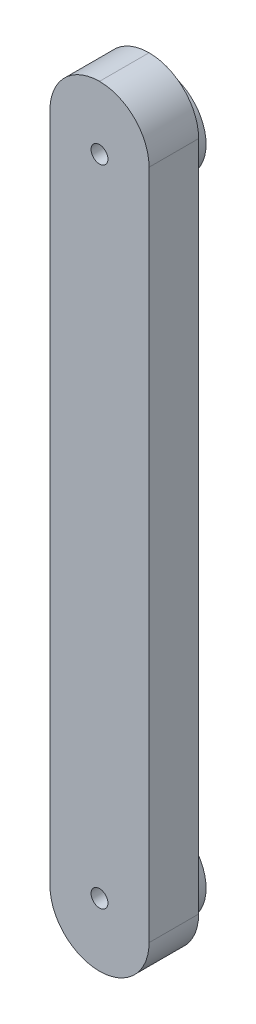
ISO-10303-21;
HEADER;
FILE_DESCRIPTION(('STEP AP214'),'2;1');
FILE_NAME('part.step','',(''),(''),'','','');
FILE_SCHEMA(('AUTOMOTIVE_DESIGN { 1 0 10303 214 1 1 1 1 }'));
ENDSEC;
DATA;
#1=APPLICATION_CONTEXT('core data for automotive mechanical design processes');
#2=APPLICATION_PROTOCOL_DEFINITION('international standard','automotive_design',2000,#1);
#3=PRODUCT_CONTEXT('',#1,'mechanical');
#4=PRODUCT('Part','Part','',(#3));
#5=PRODUCT_RELATED_PRODUCT_CATEGORY('part','',(#4));
#6=PRODUCT_DEFINITION_FORMATION('','',#4);
#7=PRODUCT_DEFINITION_CONTEXT('part definition',#1,'design');
#8=PRODUCT_DEFINITION('design','',#6,#7);
#9=PRODUCT_DEFINITION_SHAPE('','',#8);
#10=(LENGTH_UNIT() NAMED_UNIT(*) SI_UNIT(.MILLI.,.METRE.));
#11=(NAMED_UNIT(*) PLANE_ANGLE_UNIT() SI_UNIT($,.RADIAN.));
#12=(NAMED_UNIT(*) SI_UNIT($,.STERADIAN.) SOLID_ANGLE_UNIT());
#13=UNCERTAINTY_MEASURE_WITH_UNIT(LENGTH_MEASURE(1.E-05),#10,'distance_accuracy_value','');
#14=(GEOMETRIC_REPRESENTATION_CONTEXT(3) GLOBAL_UNCERTAINTY_ASSIGNED_CONTEXT((#13)) GLOBAL_UNIT_ASSIGNED_CONTEXT((#10,
#11,#12)) REPRESENTATION_CONTEXT('',''));
#15=CARTESIAN_POINT('',(0.,0.,0.));
#16=DIRECTION('',(0.,0.,1.));
#17=DIRECTION('',(1.,0.,0.));
#18=AXIS2_PLACEMENT_3D('',#15,#16,#17);
#19=CARTESIAN_POINT('',(-9.99999999999999,77.75,10.));
#20=DIRECTION('',(1.,0.,0.));
#21=DIRECTION('',(0.,1.,0.));
#22=AXIS2_PLACEMENT_3D('',#19,#20,#21);
#23=PLANE('',#22);
#24=DIRECTION('',(0.,-1.,0.));
#25=VECTOR('',#24,1.);
#26=CARTESIAN_POINT('',(-9.99999999999999,77.75,0.));
#27=LINE('',#26,#25);
#28=CARTESIAN_POINT('',(-9.99999999999999,67.75,0.));
#29=VERTEX_POINT('',#28);
#30=CARTESIAN_POINT('',(-9.99999999999999,-67.75,0.));
#31=VERTEX_POINT('',#30);
#32=EDGE_CURVE('E113',#29,#31,#27,.T.);
#33=ORIENTED_EDGE('',*,*,#32,.T.);
#34=DIRECTION('',(0.,0.,-1.));
#35=VECTOR('',#34,1.);
#36=CARTESIAN_POINT('',(-9.99999999999999,-67.75,10.));
#37=LINE('',#36,#35);
#38=CARTESIAN_POINT('',(-9.99999999999999,-67.75,10.));
#39=VERTEX_POINT('',#38);
#40=EDGE_CURVE('E11',#31,#39,#37,.F.);
#41=ORIENTED_EDGE('',*,*,#40,.T.);
#42=DIRECTION('',(0.,-1.,0.));
#43=VECTOR('',#42,1.);
#44=CARTESIAN_POINT('',(-9.99999999999999,77.75,10.));
#45=LINE('',#44,#43);
#46=CARTESIAN_POINT('',(-9.99999999999999,67.75,10.));
#47=VERTEX_POINT('',#46);
#48=EDGE_CURVE('E112',#47,#39,#45,.T.);
#49=ORIENTED_EDGE('',*,*,#48,.F.);
#50=DIRECTION('',(0.,0.,-1.));
#51=VECTOR('',#50,1.);
#52=CARTESIAN_POINT('',(-9.99999999999999,67.75,10.));
#53=LINE('',#52,#51);
#54=EDGE_CURVE('E43',#47,#29,#53,.T.);
#55=ORIENTED_EDGE('',*,*,#54,.T.);
#56=EDGE_LOOP('',(#33,#41,#49,#55));
#57=FACE_BOUND('',#56,.T.);
#58=ADVANCED_FACE('F34',(#57),#23,.F.);
#59=CARTESIAN_POINT('',(10.,77.75,10.));
#60=DIRECTION('',(-1.,0.,0.));
#61=DIRECTION('',(0.,0.,1.));
#62=AXIS2_PLACEMENT_3D('',#59,#60,#61);
#63=PLANE('',#62);
#64=DIRECTION('',(0.,1.,0.));
#65=VECTOR('',#64,1.);
#66=CARTESIAN_POINT('',(10.,77.75,10.));
#67=LINE('',#66,#65);
#68=CARTESIAN_POINT('',(10.,-67.75,10.));
#69=VERTEX_POINT('',#68);
#70=CARTESIAN_POINT('',(10.,67.75,10.));
#71=VERTEX_POINT('',#70);
#72=EDGE_CURVE('E106',#69,#71,#67,.T.);
#73=ORIENTED_EDGE('',*,*,#72,.F.);
#74=DIRECTION('',(0.,0.,-1.));
#75=VECTOR('',#74,1.);
#76=CARTESIAN_POINT('',(10.,-67.75,10.));
#77=LINE('',#76,#75);
#78=CARTESIAN_POINT('',(10.,-67.75,0.));
#79=VERTEX_POINT('',#78);
#80=EDGE_CURVE('E93',#69,#79,#77,.T.);
#81=ORIENTED_EDGE('',*,*,#80,.T.);
#82=DIRECTION('',(0.,1.,0.));
#83=VECTOR('',#82,1.);
#84=CARTESIAN_POINT('',(10.,77.75,0.));
#85=LINE('',#84,#83);
#86=CARTESIAN_POINT('',(10.,67.75,0.));
#87=VERTEX_POINT('',#86);
#88=EDGE_CURVE('E104',#79,#87,#85,.T.);
#89=ORIENTED_EDGE('',*,*,#88,.T.);
#90=DIRECTION('',(0.,0.,-1.));
#91=VECTOR('',#90,1.);
#92=CARTESIAN_POINT('',(10.,67.75,10.));
#93=LINE('',#92,#91);
#94=EDGE_CURVE('E108',#87,#71,#93,.F.);
#95=ORIENTED_EDGE('',*,*,#94,.T.);
#96=EDGE_LOOP('',(#73,#81,#89,#95));
#97=FACE_BOUND('',#96,.T.);
#98=ADVANCED_FACE('F103',(#97),#63,.F.);
#99=CARTESIAN_POINT('',(0.,0.,10.));
#100=DIRECTION('',(0.,0.,1.));
#101=DIRECTION('',(1.,0.,0.));
#102=AXIS2_PLACEMENT_3D('',#99,#100,#101);
#103=PLANE('',#102);
#104=CARTESIAN_POINT('',(0.,65.,10.));
#105=DIRECTION('',(0.,0.,-1.));
#106=DIRECTION('',(-1.,0.,0.));
#107=AXIS2_PLACEMENT_3D('',#104,#105,#106);
#108=CIRCLE('',#107,1.7);
#109=CARTESIAN_POINT('',(-1.70000000000002,65.,10.));
#110=VERTEX_POINT('',#109);
#111=EDGE_CURVE('E155',#110,#110,#108,.T.);
#112=ORIENTED_EDGE('',*,*,#111,.T.);
#113=EDGE_LOOP('',(#112));
#114=FACE_BOUND('',#113,.T.);
#115=CARTESIAN_POINT('',(0.,-65.,10.));
#116=DIRECTION('',(0.,0.,-1.));
#117=DIRECTION('',(-1.,0.,0.));
#118=AXIS2_PLACEMENT_3D('',#115,#116,#117);
#119=CIRCLE('',#118,1.7);
#120=CARTESIAN_POINT('',(-1.70000000000002,-65.,10.));
#121=VERTEX_POINT('',#120);
#122=EDGE_CURVE('E141',#121,#121,#119,.T.);
#123=ORIENTED_EDGE('',*,*,#122,.T.);
#124=EDGE_LOOP('',(#123));
#125=FACE_BOUND('',#124,.T.);
#126=CARTESIAN_POINT('',(0.,-67.75,10.));
#127=DIRECTION('',(0.,0.,1.));
#128=DIRECTION('',(1.,0.,0.));
#129=AXIS2_PLACEMENT_3D('',#126,#127,#128);
#130=CIRCLE('',#129,10.);
#131=CARTESIAN_POINT('',(0.,-77.75,10.));
#132=VERTEX_POINT('',#131);
#133=EDGE_CURVE('E58',#39,#132,#130,.T.);
#134=ORIENTED_EDGE('',*,*,#133,.T.);
#135=CARTESIAN_POINT('',(0.,-67.75,10.));
#136=DIRECTION('',(0.,0.,1.));
#137=DIRECTION('',(1.,0.,0.));
#138=AXIS2_PLACEMENT_3D('',#135,#136,#137);
#139=CIRCLE('',#138,10.);
#140=EDGE_CURVE('E136',#132,#69,#139,.T.);
#141=ORIENTED_EDGE('',*,*,#140,.T.);
#142=ORIENTED_EDGE('',*,*,#72,.T.);
#143=CARTESIAN_POINT('',(0.,67.75,10.));
#144=DIRECTION('',(0.,0.,1.));
#145=DIRECTION('',(1.,0.,0.));
#146=AXIS2_PLACEMENT_3D('',#143,#144,#145);
#147=CIRCLE('',#146,10.);
#148=CARTESIAN_POINT('',(0.,77.75,10.));
#149=VERTEX_POINT('',#148);
#150=EDGE_CURVE('E51',#71,#149,#147,.T.);
#151=ORIENTED_EDGE('',*,*,#150,.T.);
#152=CARTESIAN_POINT('',(0.,67.75,10.));
#153=DIRECTION('',(0.,0.,1.));
#154=DIRECTION('',(1.,0.,0.));
#155=AXIS2_PLACEMENT_3D('',#152,#153,#154);
#156=CIRCLE('',#155,10.);
#157=EDGE_CURVE('E133',#149,#47,#156,.T.);
#158=ORIENTED_EDGE('',*,*,#157,.T.);
#159=ORIENTED_EDGE('',*,*,#48,.T.);
#160=EDGE_LOOP('',(#134,#141,#142,#151,#158,#159));
#161=FACE_BOUND('',#160,.T.);
#162=ADVANCED_FACE('F149',(#114,#125,#161),#103,.T.);
#163=CARTESIAN_POINT('',(0.,0.,0.));
#164=DIRECTION('',(0.,0.,1.));
#165=DIRECTION('',(1.,0.,0.));
#166=AXIS2_PLACEMENT_3D('',#163,#164,#165);
#167=PLANE('',#166);
#168=CARTESIAN_POINT('',(0.,-65.,0.));
#169=DIRECTION('',(0.,0.,1.));
#170=DIRECTION('',(1.,0.,0.));
#171=AXIS2_PLACEMENT_3D('',#168,#169,#170);
#172=CIRCLE('',#171,9.);
#173=CARTESIAN_POINT('',(8.99999999999999,-65.,0.));
#174=VERTEX_POINT('',#173);
#175=EDGE_CURVE('E124',#174,#174,#172,.F.);
#176=ORIENTED_EDGE('',*,*,#175,.F.);
#177=EDGE_LOOP('',(#176));
#178=FACE_BOUND('',#177,.T.);
#179=CARTESIAN_POINT('',(0.,65.,0.));
#180=DIRECTION('',(0.,0.,1.));
#181=DIRECTION('',(1.,0.,0.));
#182=AXIS2_PLACEMENT_3D('',#179,#180,#181);
#183=CIRCLE('',#182,9.);
#184=CARTESIAN_POINT('',(8.99999999999998,65.,0.));
#185=VERTEX_POINT('',#184);
#186=EDGE_CURVE('E121',#185,#185,#183,.F.);
#187=ORIENTED_EDGE('',*,*,#186,.F.);
#188=EDGE_LOOP('',(#187));
#189=FACE_BOUND('',#188,.T.);
#190=ORIENTED_EDGE('',*,*,#88,.F.);
#191=CARTESIAN_POINT('',(0.,-67.75,0.));
#192=DIRECTION('',(0.,0.,1.));
#193=DIRECTION('',(1.,0.,0.));
#194=AXIS2_PLACEMENT_3D('',#191,#192,#193);
#195=CIRCLE('',#194,10.);
#196=CARTESIAN_POINT('',(0.,-77.75,0.));
#197=VERTEX_POINT('',#196);
#198=EDGE_CURVE('E89',#79,#197,#195,.F.);
#199=ORIENTED_EDGE('',*,*,#198,.T.);
#200=CARTESIAN_POINT('',(0.,-67.75,0.));
#201=DIRECTION('',(0.,0.,1.));
#202=DIRECTION('',(1.,0.,0.));
#203=AXIS2_PLACEMENT_3D('',#200,#201,#202);
#204=CIRCLE('',#203,10.);
#205=EDGE_CURVE('E98',#197,#31,#204,.F.);
#206=ORIENTED_EDGE('',*,*,#205,.T.);
#207=ORIENTED_EDGE('',*,*,#32,.F.);
#208=CARTESIAN_POINT('',(0.,67.75,0.));
#209=DIRECTION('',(0.,0.,1.));
#210=DIRECTION('',(1.,0.,0.));
#211=AXIS2_PLACEMENT_3D('',#208,#209,#210);
#212=CIRCLE('',#211,10.);
#213=CARTESIAN_POINT('',(0.,77.75,0.));
#214=VERTEX_POINT('',#213);
#215=EDGE_CURVE('E129',#29,#214,#212,.F.);
#216=ORIENTED_EDGE('',*,*,#215,.T.);
#217=CARTESIAN_POINT('',(0.,67.75,0.));
#218=DIRECTION('',(0.,0.,1.));
#219=DIRECTION('',(1.,0.,0.));
#220=AXIS2_PLACEMENT_3D('',#217,#218,#219);
#221=CIRCLE('',#220,10.);
#222=EDGE_CURVE('E107',#214,#87,#221,.F.);
#223=ORIENTED_EDGE('',*,*,#222,.T.);
#224=EDGE_LOOP('',(#190,#199,#206,#207,#216,#223));
#225=FACE_BOUND('',#224,.T.);
#226=ADVANCED_FACE('F110',(#178,#189,#225),#167,.F.);
#227=CARTESIAN_POINT('',(0.,65.,-2.5));
#228=DIRECTION('',(0.,0.,1.));
#229=DIRECTION('',(1.,0.,0.));
#230=AXIS2_PLACEMENT_3D('',#227,#228,#229);
#231=CYLINDRICAL_SURFACE('',#230,9.);
#232=CARTESIAN_POINT('',(0.,65.,-2.5));
#233=DIRECTION('',(0.,0.,-1.));
#234=DIRECTION('',(-1.,0.,0.));
#235=AXIS2_PLACEMENT_3D('',#232,#233,#234);
#236=CIRCLE('',#235,9.);
#237=CARTESIAN_POINT('',(-9.00000000000001,65.,-2.5));
#238=VERTEX_POINT('',#237);
#239=EDGE_CURVE('E117',#238,#238,#236,.T.);
#240=ORIENTED_EDGE('',*,*,#239,.F.);
#241=EDGE_LOOP('',(#240));
#242=FACE_BOUND('',#241,.T.);
#243=ORIENTED_EDGE('',*,*,#186,.T.);
#244=EDGE_LOOP('',(#243));
#245=FACE_BOUND('',#244,.T.);
#246=ADVANCED_FACE('F179',(#242,#245),#231,.T.);
#247=CARTESIAN_POINT('',(0.,65.,-2.5));
#248=DIRECTION('',(0.,0.,-1.));
#249=DIRECTION('',(-1.,0.,0.));
#250=AXIS2_PLACEMENT_3D('',#247,#248,#249);
#251=PLANE('',#250);
#252=CARTESIAN_POINT('',(0.,65.,-2.5));
#253=DIRECTION('',(0.,0.,-1.));
#254=DIRECTION('',(-1.,0.,0.));
#255=AXIS2_PLACEMENT_3D('',#252,#253,#254);
#256=CIRCLE('',#255,1.7);
#257=CARTESIAN_POINT('',(-1.70000000000002,65.,-2.5));
#258=VERTEX_POINT('',#257);
#259=EDGE_CURVE('E159',#258,#258,#256,.T.);
#260=ORIENTED_EDGE('',*,*,#259,.F.);
#261=EDGE_LOOP('',(#260));
#262=FACE_BOUND('',#261,.T.);
#263=ORIENTED_EDGE('',*,*,#239,.T.);
#264=EDGE_LOOP('',(#263));
#265=FACE_BOUND('',#264,.T.);
#266=ADVANCED_FACE('F175',(#262,#265),#251,.T.);
#267=CARTESIAN_POINT('',(0.,-65.,-2.5));
#268=DIRECTION('',(0.,0.,1.));
#269=DIRECTION('',(1.,0.,0.));
#270=AXIS2_PLACEMENT_3D('',#267,#268,#269);
#271=CYLINDRICAL_SURFACE('',#270,9.);
#272=CARTESIAN_POINT('',(0.,-65.,-2.5));
#273=DIRECTION('',(0.,0.,-1.));
#274=DIRECTION('',(-1.,0.,0.));
#275=AXIS2_PLACEMENT_3D('',#272,#273,#274);
#276=CIRCLE('',#275,9.);
#277=CARTESIAN_POINT('',(-9.00000000000001,-65.,-2.5));
#278=VERTEX_POINT('',#277);
#279=EDGE_CURVE('E153',#278,#278,#276,.T.);
#280=ORIENTED_EDGE('',*,*,#279,.F.);
#281=EDGE_LOOP('',(#280));
#282=FACE_BOUND('',#281,.T.);
#283=ORIENTED_EDGE('',*,*,#175,.T.);
#284=EDGE_LOOP('',(#283));
#285=FACE_BOUND('',#284,.T.);
#286=ADVANCED_FACE('F178',(#282,#285),#271,.T.);
#287=CARTESIAN_POINT('',(0.,-65.,-2.5));
#288=DIRECTION('',(0.,0.,-1.));
#289=DIRECTION('',(-1.,0.,0.));
#290=AXIS2_PLACEMENT_3D('',#287,#288,#289);
#291=PLANE('',#290);
#292=CARTESIAN_POINT('',(0.,-65.,-2.5));
#293=DIRECTION('',(0.,0.,-1.));
#294=DIRECTION('',(-1.,0.,0.));
#295=AXIS2_PLACEMENT_3D('',#292,#293,#294);
#296=CIRCLE('',#295,1.7);
#297=CARTESIAN_POINT('',(-1.70000000000002,-65.,-2.5));
#298=VERTEX_POINT('',#297);
#299=EDGE_CURVE('E139',#298,#298,#296,.T.);
#300=ORIENTED_EDGE('',*,*,#299,.F.);
#301=EDGE_LOOP('',(#300));
#302=FACE_BOUND('',#301,.T.);
#303=ORIENTED_EDGE('',*,*,#279,.T.);
#304=EDGE_LOOP('',(#303));
#305=FACE_BOUND('',#304,.T.);
#306=ADVANCED_FACE('F232',(#302,#305),#291,.T.);
#307=CARTESIAN_POINT('',(0.,-65.,10.));
#308=DIRECTION('',(0.,0.,-1.));
#309=DIRECTION('',(-1.,0.,0.));
#310=AXIS2_PLACEMENT_3D('',#307,#308,#309);
#311=CYLINDRICAL_SURFACE('',#310,1.7);
#312=ORIENTED_EDGE('',*,*,#122,.F.);
#313=EDGE_LOOP('',(#312));
#314=FACE_BOUND('',#313,.T.);
#315=ORIENTED_EDGE('',*,*,#299,.T.);
#316=EDGE_LOOP('',(#315));
#317=FACE_BOUND('',#316,.T.);
#318=ADVANCED_FACE('F171',(#314,#317),#311,.F.);
#319=CARTESIAN_POINT('',(0.,65.,10.));
#320=DIRECTION('',(0.,0.,-1.));
#321=DIRECTION('',(-1.,0.,0.));
#322=AXIS2_PLACEMENT_3D('',#319,#320,#321);
#323=CYLINDRICAL_SURFACE('',#322,1.7);
#324=ORIENTED_EDGE('',*,*,#111,.F.);
#325=EDGE_LOOP('',(#324));
#326=FACE_BOUND('',#325,.T.);
#327=ORIENTED_EDGE('',*,*,#259,.T.);
#328=EDGE_LOOP('',(#327));
#329=FACE_BOUND('',#328,.T.);
#330=ADVANCED_FACE('F167',(#326,#329),#323,.F.);
#331=CARTESIAN_POINT('',(0.,-67.75,10.));
#332=DIRECTION('',(0.,0.,-1.));
#333=DIRECTION('',(-1.,0.,0.));
#334=AXIS2_PLACEMENT_3D('',#331,#332,#333);
#335=CYLINDRICAL_SURFACE('',#334,10.);
#336=DIRECTION('',(0.,0.,-1.));
#337=VECTOR('',#336,1.);
#338=CARTESIAN_POINT('',(0.,-77.75,10.));
#339=LINE('',#338,#337);
#340=EDGE_CURVE('E94',#132,#197,#339,.T.);
#341=ORIENTED_EDGE('',*,*,#340,.F.);
#342=ORIENTED_EDGE('',*,*,#133,.F.);
#343=ORIENTED_EDGE('',*,*,#40,.F.);
#344=ORIENTED_EDGE('',*,*,#205,.F.);
#345=EDGE_LOOP('',(#341,#342,#343,#344));
#346=FACE_BOUND('',#345,.T.);
#347=ADVANCED_FACE('F170',(#346),#335,.T.);
#348=CARTESIAN_POINT('',(0.,-67.75,10.));
#349=DIRECTION('',(0.,0.,-1.));
#350=DIRECTION('',(-1.,0.,0.));
#351=AXIS2_PLACEMENT_3D('',#348,#349,#350);
#352=CYLINDRICAL_SURFACE('',#351,10.);
#353=ORIENTED_EDGE('',*,*,#140,.F.);
#354=ORIENTED_EDGE('',*,*,#340,.T.);
#355=ORIENTED_EDGE('',*,*,#198,.F.);
#356=ORIENTED_EDGE('',*,*,#80,.F.);
#357=EDGE_LOOP('',(#353,#354,#355,#356));
#358=FACE_BOUND('',#357,.T.);
#359=ADVANCED_FACE('F92',(#358),#352,.T.);
#360=CARTESIAN_POINT('',(0.,67.75,10.));
#361=DIRECTION('',(0.,0.,-1.));
#362=DIRECTION('',(-1.,0.,0.));
#363=AXIS2_PLACEMENT_3D('',#360,#361,#362);
#364=CYLINDRICAL_SURFACE('',#363,10.);
#365=DIRECTION('',(0.,0.,-1.));
#366=VECTOR('',#365,1.);
#367=CARTESIAN_POINT('',(0.,77.75,10.));
#368=LINE('',#367,#366);
#369=EDGE_CURVE('E38',#149,#214,#368,.T.);
#370=ORIENTED_EDGE('',*,*,#369,.F.);
#371=ORIENTED_EDGE('',*,*,#150,.F.);
#372=ORIENTED_EDGE('',*,*,#94,.F.);
#373=ORIENTED_EDGE('',*,*,#222,.F.);
#374=EDGE_LOOP('',(#370,#371,#372,#373));
#375=FACE_BOUND('',#374,.T.);
#376=ADVANCED_FACE('F36',(#375),#364,.T.);
#377=CARTESIAN_POINT('',(0.,67.75,10.));
#378=DIRECTION('',(0.,0.,-1.));
#379=DIRECTION('',(-1.,0.,0.));
#380=AXIS2_PLACEMENT_3D('',#377,#378,#379);
#381=CYLINDRICAL_SURFACE('',#380,10.);
#382=ORIENTED_EDGE('',*,*,#157,.F.);
#383=ORIENTED_EDGE('',*,*,#369,.T.);
#384=ORIENTED_EDGE('',*,*,#215,.F.);
#385=ORIENTED_EDGE('',*,*,#54,.F.);
#386=EDGE_LOOP('',(#382,#383,#384,#385));
#387=FACE_BOUND('',#386,.T.);
#388=ADVANCED_FACE('F146',(#387),#381,.T.);
#389=CLOSED_SHELL('',(#58,#98,#162,#226,#246,#266,#286,#306,#318,#330,#347,#359,#376,#388));
#390=MANIFOLD_SOLID_BREP('B2',#389);
#391=ADVANCED_BREP_SHAPE_REPRESENTATION('',(#18,#390),#14);
#392=SHAPE_DEFINITION_REPRESENTATION(#9,#391);
ENDSEC;
END-ISO-10303-21;
